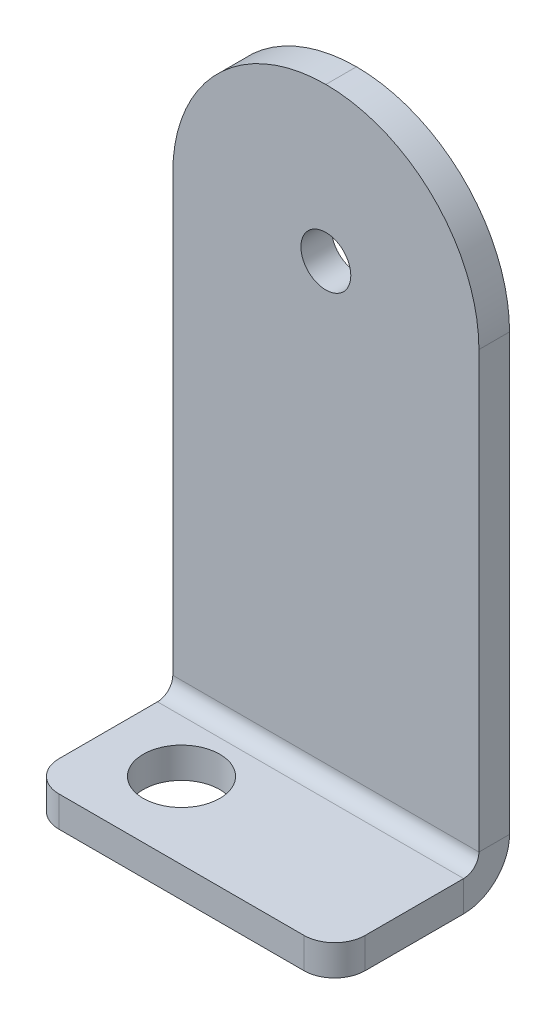
ISO-10303-21;
HEADER;
FILE_DESCRIPTION(('STEP AP214'),'2;1');
FILE_NAME('part.step','',(''),(''),'','','');
FILE_SCHEMA(('AUTOMOTIVE_DESIGN { 1 0 10303 214 1 1 1 1 }'));
ENDSEC;
DATA;
#1=APPLICATION_CONTEXT('core data for automotive mechanical design processes');
#2=APPLICATION_PROTOCOL_DEFINITION('international standard','automotive_design',2000,#1);
#3=PRODUCT_CONTEXT('',#1,'mechanical');
#4=PRODUCT('Part','Part','',(#3));
#5=PRODUCT_RELATED_PRODUCT_CATEGORY('part','',(#4));
#6=PRODUCT_DEFINITION_FORMATION('','',#4);
#7=PRODUCT_DEFINITION_CONTEXT('part definition',#1,'design');
#8=PRODUCT_DEFINITION('design','',#6,#7);
#9=PRODUCT_DEFINITION_SHAPE('','',#8);
#10=(LENGTH_UNIT() NAMED_UNIT(*) SI_UNIT(.MILLI.,.METRE.));
#11=(NAMED_UNIT(*) PLANE_ANGLE_UNIT() SI_UNIT($,.RADIAN.));
#12=(NAMED_UNIT(*) SI_UNIT($,.STERADIAN.) SOLID_ANGLE_UNIT());
#13=UNCERTAINTY_MEASURE_WITH_UNIT(LENGTH_MEASURE(1.E-05),#10,'distance_accuracy_value','');
#14=(GEOMETRIC_REPRESENTATION_CONTEXT(3) GLOBAL_UNCERTAINTY_ASSIGNED_CONTEXT((#13)) GLOBAL_UNIT_ASSIGNED_CONTEXT((#10,
#11,#12)) REPRESENTATION_CONTEXT('',''));
#15=CARTESIAN_POINT('',(0.,0.,0.));
#16=DIRECTION('',(0.,0.,1.));
#17=DIRECTION('',(1.,0.,0.));
#18=AXIS2_PLACEMENT_3D('',#15,#16,#17);
#19=CARTESIAN_POINT('',(0.,10.8849113350296,11.9750886649705));
#20=DIRECTION('',(0.,1.,0.));
#21=DIRECTION('',(1.,0.,0.));
#22=AXIS2_PLACEMENT_3D('',#19,#20,#21);
#23=PLANE('',#22);
#24=CARTESIAN_POINT('',(-19.05,10.8849113350295,5.6250886649705));
#25=DIRECTION('',(0.,1.,0.));
#26=DIRECTION('',(1.,0.,0.));
#27=AXIS2_PLACEMENT_3D('',#24,#25,#26);
#28=CIRCLE('',#27,3.175);
#29=CARTESIAN_POINT('',(-15.875,10.8849113350295,5.6250886649705));
#30=VERTEX_POINT('',#29);
#31=EDGE_CURVE('E180',#30,#30,#28,.T.);
#32=ORIENTED_EDGE('',*,*,#31,.T.);
#33=EDGE_LOOP('',(#32));
#34=FACE_BOUND('',#33,.T.);
#35=DIRECTION('',(0.,0.,-1.));
#36=VECTOR('',#35,1.);
#37=CARTESIAN_POINT('',(0.,10.8849113350296,11.9750886649705));
#38=LINE('',#37,#36);
#39=CARTESIAN_POINT('',(0.,10.8849113350296,9.4350886649705));
#40=VERTEX_POINT('',#39);
#41=CARTESIAN_POINT('',(0.,10.8849113350295,1.27000000000001));
#42=VERTEX_POINT('',#41);
#43=EDGE_CURVE('E195',#40,#42,#38,.T.);
#44=ORIENTED_EDGE('',*,*,#43,.F.);
#45=CARTESIAN_POINT('',(-2.54,10.8849113350296,9.4350886649705));
#46=DIRECTION('',(0.,1.,0.));
#47=DIRECTION('',(0.,0.,1.));
#48=AXIS2_PLACEMENT_3D('',#45,#46,#47);
#49=CIRCLE('',#48,2.54);
#50=CARTESIAN_POINT('',(-2.54,10.8849113350296,11.9750886649705));
#51=VERTEX_POINT('',#50);
#52=EDGE_CURVE('E53',#40,#51,#49,.F.);
#53=ORIENTED_EDGE('',*,*,#52,.T.);
#54=DIRECTION('',(1.,0.,0.));
#55=VECTOR('',#54,1.);
#56=CARTESIAN_POINT('',(0.,10.8849113350296,11.9750886649705));
#57=LINE('',#56,#55);
#58=CARTESIAN_POINT('',(-22.86,10.8849113350296,11.9750886649705));
#59=VERTEX_POINT('',#58);
#60=EDGE_CURVE('E188',#59,#51,#57,.T.);
#61=ORIENTED_EDGE('',*,*,#60,.F.);
#62=CARTESIAN_POINT('',(-22.86,10.8849113350296,9.4350886649705));
#63=DIRECTION('',(0.,1.,0.));
#64=DIRECTION('',(0.,0.,1.));
#65=AXIS2_PLACEMENT_3D('',#62,#63,#64);
#66=CIRCLE('',#65,2.54);
#67=CARTESIAN_POINT('',(-25.4,10.8849113350296,9.4350886649705));
#68=VERTEX_POINT('',#67);
#69=EDGE_CURVE('E60',#59,#68,#66,.F.);
#70=ORIENTED_EDGE('',*,*,#69,.T.);
#71=DIRECTION('',(0.,0.,1.));
#72=VECTOR('',#71,1.);
#73=CARTESIAN_POINT('',(-25.4,10.8849113350296,11.9750886649705));
#74=LINE('',#73,#72);
#75=CARTESIAN_POINT('',(-25.4,10.8849113350295,1.27000000000001));
#76=VERTEX_POINT('',#75);
#77=EDGE_CURVE('E191',#76,#68,#74,.T.);
#78=ORIENTED_EDGE('',*,*,#77,.F.);
#79=DIRECTION('',(1.,0.,0.));
#80=VECTOR('',#79,1.);
#81=CARTESIAN_POINT('',(0.,10.8849113350295,1.27000000000001));
#82=LINE('',#81,#80);
#83=EDGE_CURVE('E162',#76,#42,#82,.T.);
#84=ORIENTED_EDGE('',*,*,#83,.T.);
#85=EDGE_LOOP('',(#44,#53,#61,#70,#78,#84));
#86=FACE_BOUND('',#85,.T.);
#87=ADVANCED_FACE('F45',(#34,#86),#23,.F.);
#88=CARTESIAN_POINT('',(0.,10.8849113350296,11.9750886649705));
#89=DIRECTION('',(1.,0.,0.));
#90=DIRECTION('',(0.,-1.,0.));
#91=AXIS2_PLACEMENT_3D('',#88,#89,#90);
#92=PLANE('',#91);
#93=DIRECTION('',(0.,0.,-1.));
#94=VECTOR('',#93,1.);
#95=CARTESIAN_POINT('',(0.,13.4249113350296,11.9750886649705));
#96=LINE('',#95,#94);
#97=CARTESIAN_POINT('',(0.,13.4249113350296,9.43508866497049));
#98=VERTEX_POINT('',#97);
#99=CARTESIAN_POINT('',(0.,13.4249113350295,1.27000000000002));
#100=VERTEX_POINT('',#99);
#101=EDGE_CURVE('E184',#98,#100,#96,.T.);
#102=ORIENTED_EDGE('',*,*,#101,.F.);
#103=DIRECTION('',(0.,1.,0.));
#104=VECTOR('',#103,1.);
#105=CARTESIAN_POINT('',(0.,10.8849113350296,9.4350886649705));
#106=LINE('',#105,#104);
#107=EDGE_CURVE('E68',#98,#40,#106,.F.);
#108=ORIENTED_EDGE('',*,*,#107,.T.);
#109=ORIENTED_EDGE('',*,*,#43,.T.);
#110=DIRECTION('',(0.,-1.,0.));
#111=VECTOR('',#110,1.);
#112=CARTESIAN_POINT('',(0.,10.8849113350296,1.27000000000001));
#113=LINE('',#112,#111);
#114=EDGE_CURVE('E204',#100,#42,#113,.T.);
#115=ORIENTED_EDGE('',*,*,#114,.F.);
#116=EDGE_LOOP('',(#102,#108,#109,#115));
#117=FACE_BOUND('',#116,.T.);
#118=ADVANCED_FACE('F250',(#117),#92,.T.);
#119=CARTESIAN_POINT('',(0.,10.8849113350296,11.9750886649705));
#120=DIRECTION('',(0.,0.,1.));
#121=DIRECTION('',(1.,0.,0.));
#122=AXIS2_PLACEMENT_3D('',#119,#120,#121);
#123=PLANE('',#122);
#124=ORIENTED_EDGE('',*,*,#60,.T.);
#125=DIRECTION('',(0.,1.,0.));
#126=VECTOR('',#125,1.);
#127=CARTESIAN_POINT('',(-2.54,10.8849113350296,11.9750886649705));
#128=LINE('',#127,#126);
#129=CARTESIAN_POINT('',(-2.54,13.4249113350296,11.9750886649705));
#130=VERTEX_POINT('',#129);
#131=EDGE_CURVE('E229',#51,#130,#128,.T.);
#132=ORIENTED_EDGE('',*,*,#131,.T.);
#133=DIRECTION('',(1.,0.,0.));
#134=VECTOR('',#133,1.);
#135=CARTESIAN_POINT('',(0.,13.4249113350296,11.9750886649705));
#136=LINE('',#135,#134);
#137=CARTESIAN_POINT('',(-22.86,13.4249113350296,11.9750886649705));
#138=VERTEX_POINT('',#137);
#139=EDGE_CURVE('E192',#138,#130,#136,.T.);
#140=ORIENTED_EDGE('',*,*,#139,.F.);
#141=DIRECTION('',(0.,1.,0.));
#142=VECTOR('',#141,1.);
#143=CARTESIAN_POINT('',(-22.86,10.8849113350296,11.9750886649705));
#144=LINE('',#143,#142);
#145=EDGE_CURVE('E224',#138,#59,#144,.F.);
#146=ORIENTED_EDGE('',*,*,#145,.T.);
#147=EDGE_LOOP('',(#124,#132,#140,#146));
#148=FACE_BOUND('',#147,.T.);
#149=ADVANCED_FACE('F241',(#148),#123,.T.);
#150=CARTESIAN_POINT('',(-25.4,10.8849113350296,11.9750886649705));
#151=DIRECTION('',(-1.,0.,0.));
#152=DIRECTION('',(0.,1.,0.));
#153=AXIS2_PLACEMENT_3D('',#150,#151,#152);
#154=PLANE('',#153);
#155=ORIENTED_EDGE('',*,*,#77,.T.);
#156=DIRECTION('',(0.,1.,0.));
#157=VECTOR('',#156,1.);
#158=CARTESIAN_POINT('',(-25.4,10.8849113350296,9.4350886649705));
#159=LINE('',#158,#157);
#160=CARTESIAN_POINT('',(-25.4,13.4249113350296,9.4350886649705));
#161=VERTEX_POINT('',#160);
#162=EDGE_CURVE('E12',#68,#161,#159,.T.);
#163=ORIENTED_EDGE('',*,*,#162,.T.);
#164=DIRECTION('',(0.,0.,1.));
#165=VECTOR('',#164,1.);
#166=CARTESIAN_POINT('',(-25.4,13.4249113350296,11.9750886649705));
#167=LINE('',#166,#165);
#168=CARTESIAN_POINT('',(-25.4,13.4249113350295,1.27000000000002));
#169=VERTEX_POINT('',#168);
#170=EDGE_CURVE('E196',#169,#161,#167,.T.);
#171=ORIENTED_EDGE('',*,*,#170,.F.);
#172=DIRECTION('',(0.,1.,0.));
#173=VECTOR('',#172,1.);
#174=CARTESIAN_POINT('',(-25.4,10.8849113350296,1.27000000000001));
#175=LINE('',#174,#173);
#176=EDGE_CURVE('E198',#76,#169,#175,.T.);
#177=ORIENTED_EDGE('',*,*,#176,.F.);
#178=EDGE_LOOP('',(#155,#163,#171,#177));
#179=FACE_BOUND('',#178,.T.);
#180=ADVANCED_FACE('F262',(#179),#154,.T.);
#181=CARTESIAN_POINT('',(0.,13.4249113350296,11.9750886649705));
#182=DIRECTION('',(0.,1.,0.));
#183=DIRECTION('',(1.,0.,0.));
#184=AXIS2_PLACEMENT_3D('',#181,#182,#183);
#185=PLANE('',#184);
#186=ORIENTED_EDGE('',*,*,#139,.T.);
#187=CARTESIAN_POINT('',(-2.54,13.4249113350296,9.43508866497049));
#188=DIRECTION('',(0.,1.,0.));
#189=DIRECTION('',(0.,0.,1.));
#190=AXIS2_PLACEMENT_3D('',#187,#188,#189);
#191=CIRCLE('',#190,2.54);
#192=EDGE_CURVE('E234',#130,#98,#191,.T.);
#193=ORIENTED_EDGE('',*,*,#192,.T.);
#194=ORIENTED_EDGE('',*,*,#101,.T.);
#195=DIRECTION('',(1.,0.,0.));
#196=VECTOR('',#195,1.);
#197=CARTESIAN_POINT('',(0.,13.4249113350295,1.27000000000002));
#198=LINE('',#197,#196);
#199=EDGE_CURVE('E200',#169,#100,#198,.T.);
#200=ORIENTED_EDGE('',*,*,#199,.F.);
#201=ORIENTED_EDGE('',*,*,#170,.T.);
#202=CARTESIAN_POINT('',(-22.86,13.4249113350296,9.4350886649705));
#203=DIRECTION('',(0.,1.,0.));
#204=DIRECTION('',(0.,0.,1.));
#205=AXIS2_PLACEMENT_3D('',#202,#203,#204);
#206=CIRCLE('',#205,2.54);
#207=EDGE_CURVE('E232',#161,#138,#206,.T.);
#208=ORIENTED_EDGE('',*,*,#207,.T.);
#209=EDGE_LOOP('',(#186,#193,#194,#200,#201,#208));
#210=FACE_BOUND('',#209,.T.);
#211=CARTESIAN_POINT('',(-19.05,13.4249113350296,5.6250886649705));
#212=DIRECTION('',(0.,1.,0.));
#213=DIRECTION('',(1.,0.,0.));
#214=AXIS2_PLACEMENT_3D('',#211,#212,#213);
#215=CIRCLE('',#214,3.175);
#216=CARTESIAN_POINT('',(-15.875,13.4249113350296,5.6250886649705));
#217=VERTEX_POINT('',#216);
#218=EDGE_CURVE('E185',#217,#217,#215,.T.);
#219=ORIENTED_EDGE('',*,*,#218,.F.);
#220=EDGE_LOOP('',(#219));
#221=FACE_BOUND('',#220,.T.);
#222=ADVANCED_FACE('F246',(#210,#221),#185,.T.);
#223=CARTESIAN_POINT('',(-19.05,10.8849113350295,5.6250886649705));
#224=DIRECTION('',(0.,1.,0.));
#225=DIRECTION('',(1.,0.,0.));
#226=AXIS2_PLACEMENT_3D('',#223,#224,#225);
#227=CYLINDRICAL_SURFACE('',#226,3.175);
#228=ORIENTED_EDGE('',*,*,#31,.F.);
#229=EDGE_LOOP('',(#228));
#230=FACE_BOUND('',#229,.T.);
#231=ORIENTED_EDGE('',*,*,#218,.T.);
#232=EDGE_LOOP('',(#231));
#233=FACE_BOUND('',#232,.T.);
#234=ADVANCED_FACE('F283',(#230,#233),#227,.F.);
#235=CARTESIAN_POINT('',(-12.7,50.8,-2.54));
#236=DIRECTION('',(0.,0.,1.));
#237=DIRECTION('',(1.,0.,0.));
#238=AXIS2_PLACEMENT_3D('',#235,#236,#237);
#239=CYLINDRICAL_SURFACE('',#238,2.07009999999992);
#240=CARTESIAN_POINT('',(-12.7,50.8,-2.54));
#241=DIRECTION('',(0.,0.,1.));
#242=DIRECTION('',(1.,0.,0.));
#243=AXIS2_PLACEMENT_3D('',#240,#241,#242);
#244=CIRCLE('',#243,2.07009999999992);
#245=CARTESIAN_POINT('',(-10.6299000000001,50.8,-2.54));
#246=VERTEX_POINT('',#245);
#247=EDGE_CURVE('E140',#246,#246,#244,.T.);
#248=ORIENTED_EDGE('',*,*,#247,.F.);
#249=EDGE_LOOP('',(#248));
#250=FACE_BOUND('',#249,.T.);
#251=CARTESIAN_POINT('',(-12.7,50.8,0.));
#252=DIRECTION('',(0.,0.,1.));
#253=DIRECTION('',(1.,0.,0.));
#254=AXIS2_PLACEMENT_3D('',#251,#252,#253);
#255=CIRCLE('',#254,2.07009999999992);
#256=CARTESIAN_POINT('',(-10.6299000000001,50.8,0.));
#257=VERTEX_POINT('',#256);
#258=EDGE_CURVE('E172',#257,#257,#255,.T.);
#259=ORIENTED_EDGE('',*,*,#258,.T.);
#260=EDGE_LOOP('',(#259));
#261=FACE_BOUND('',#260,.T.);
#262=ADVANCED_FACE('F323',(#250,#261),#239,.F.);
#263=CARTESIAN_POINT('',(0.,0.,-2.54));
#264=DIRECTION('',(0.,0.,1.));
#265=DIRECTION('',(1.,0.,0.));
#266=AXIS2_PLACEMENT_3D('',#263,#264,#265);
#267=PLANE('',#266);
#268=DIRECTION('',(0.,-1.,0.));
#269=VECTOR('',#268,1.);
#270=CARTESIAN_POINT('',(-25.4,0.,-2.54));
#271=LINE('',#270,#269);
#272=CARTESIAN_POINT('',(-25.4,50.8,-2.54));
#273=VERTEX_POINT('',#272);
#274=CARTESIAN_POINT('',(-25.4,14.6949113350295,-2.54));
#275=VERTEX_POINT('',#274);
#276=EDGE_CURVE('E131',#273,#275,#271,.T.);
#277=ORIENTED_EDGE('',*,*,#276,.F.);
#278=CARTESIAN_POINT('',(-12.7,50.8,-2.54));
#279=DIRECTION('',(0.,0.,1.));
#280=DIRECTION('',(1.,0.,0.));
#281=AXIS2_PLACEMENT_3D('',#278,#279,#280);
#282=CIRCLE('',#281,12.7);
#283=CARTESIAN_POINT('',(-12.7,63.5,-2.54));
#284=VERTEX_POINT('',#283);
#285=EDGE_CURVE('E220',#273,#284,#282,.F.);
#286=ORIENTED_EDGE('',*,*,#285,.T.);
#287=CARTESIAN_POINT('',(-12.7,50.8,-2.54));
#288=DIRECTION('',(0.,0.,1.));
#289=DIRECTION('',(1.,0.,0.));
#290=AXIS2_PLACEMENT_3D('',#287,#288,#289);
#291=CIRCLE('',#290,12.7);
#292=CARTESIAN_POINT('',(0.,50.8,-2.54));
#293=VERTEX_POINT('',#292);
#294=EDGE_CURVE('E218',#284,#293,#291,.F.);
#295=ORIENTED_EDGE('',*,*,#294,.T.);
#296=DIRECTION('',(0.,1.,0.));
#297=VECTOR('',#296,1.);
#298=CARTESIAN_POINT('',(0.,0.,-2.54));
#299=LINE('',#298,#297);
#300=CARTESIAN_POINT('',(0.,14.6949113350295,-2.54));
#301=VERTEX_POINT('',#300);
#302=EDGE_CURVE('E170',#301,#293,#299,.T.);
#303=ORIENTED_EDGE('',*,*,#302,.F.);
#304=DIRECTION('',(1.,0.,0.));
#305=VECTOR('',#304,1.);
#306=CARTESIAN_POINT('',(0.,14.6949113350295,-2.54));
#307=LINE('',#306,#305);
#308=EDGE_CURVE('E159',#275,#301,#307,.T.);
#309=ORIENTED_EDGE('',*,*,#308,.F.);
#310=EDGE_LOOP('',(#277,#286,#295,#303,#309));
#311=FACE_BOUND('',#310,.T.);
#312=ORIENTED_EDGE('',*,*,#247,.T.);
#313=EDGE_LOOP('',(#312));
#314=FACE_BOUND('',#313,.T.);
#315=ADVANCED_FACE('F167',(#311,#314),#267,.F.);
#316=CARTESIAN_POINT('',(-25.4,0.,-2.54));
#317=DIRECTION('',(-1.,0.,0.));
#318=DIRECTION('',(0.,0.,1.));
#319=AXIS2_PLACEMENT_3D('',#316,#317,#318);
#320=PLANE('',#319);
#321=DIRECTION('',(0.,-1.,0.));
#322=VECTOR('',#321,1.);
#323=CARTESIAN_POINT('',(-25.4,0.,0.));
#324=LINE('',#323,#322);
#325=CARTESIAN_POINT('',(-25.4,50.8,0.));
#326=VERTEX_POINT('',#325);
#327=CARTESIAN_POINT('',(-25.4,14.6949113350295,0.));
#328=VERTEX_POINT('',#327);
#329=EDGE_CURVE('E154',#326,#328,#324,.T.);
#330=ORIENTED_EDGE('',*,*,#329,.F.);
#331=DIRECTION('',(0.,0.,1.));
#332=VECTOR('',#331,1.);
#333=CARTESIAN_POINT('',(-25.4,50.8,-2.54));
#334=LINE('',#333,#332);
#335=EDGE_CURVE('E137',#326,#273,#334,.F.);
#336=ORIENTED_EDGE('',*,*,#335,.T.);
#337=ORIENTED_EDGE('',*,*,#276,.T.);
#338=DIRECTION('',(0.,0.,1.));
#339=VECTOR('',#338,1.);
#340=CARTESIAN_POINT('',(-25.4,14.6949113350295,-2.5399999999999));
#341=LINE('',#340,#339);
#342=EDGE_CURVE('E135',#275,#328,#341,.T.);
#343=ORIENTED_EDGE('',*,*,#342,.T.);
#344=EDGE_LOOP('',(#330,#336,#337,#343));
#345=FACE_BOUND('',#344,.T.);
#346=ADVANCED_FACE('F134',(#345),#320,.T.);
#347=CARTESIAN_POINT('',(0.,0.,0.));
#348=DIRECTION('',(0.,0.,1.));
#349=DIRECTION('',(1.,0.,0.));
#350=AXIS2_PLACEMENT_3D('',#347,#348,#349);
#351=PLANE('',#350);
#352=ORIENTED_EDGE('',*,*,#258,.F.);
#353=EDGE_LOOP('',(#352));
#354=FACE_BOUND('',#353,.T.);
#355=CARTESIAN_POINT('',(-12.7,50.8,0.));
#356=DIRECTION('',(0.,0.,1.));
#357=DIRECTION('',(1.,0.,0.));
#358=AXIS2_PLACEMENT_3D('',#355,#356,#357);
#359=CIRCLE('',#358,12.7);
#360=CARTESIAN_POINT('',(0.,50.8,0.));
#361=VERTEX_POINT('',#360);
#362=CARTESIAN_POINT('',(-12.7,63.5,0.));
#363=VERTEX_POINT('',#362);
#364=EDGE_CURVE('E207',#361,#363,#359,.T.);
#365=ORIENTED_EDGE('',*,*,#364,.T.);
#366=CARTESIAN_POINT('',(-12.7,50.8,0.));
#367=DIRECTION('',(0.,0.,1.));
#368=DIRECTION('',(1.,0.,0.));
#369=AXIS2_PLACEMENT_3D('',#366,#367,#368);
#370=CIRCLE('',#369,12.7);
#371=EDGE_CURVE('E215',#363,#326,#370,.T.);
#372=ORIENTED_EDGE('',*,*,#371,.T.);
#373=ORIENTED_EDGE('',*,*,#329,.T.);
#374=DIRECTION('',(1.,0.,0.));
#375=VECTOR('',#374,1.);
#376=CARTESIAN_POINT('',(0.,14.6949113350295,0.));
#377=LINE('',#376,#375);
#378=CARTESIAN_POINT('',(0.,14.6949113350295,0.));
#379=VERTEX_POINT('',#378);
#380=EDGE_CURVE('E306',#328,#379,#377,.T.);
#381=ORIENTED_EDGE('',*,*,#380,.T.);
#382=DIRECTION('',(0.,1.,0.));
#383=VECTOR('',#382,1.);
#384=CARTESIAN_POINT('',(0.,0.,0.));
#385=LINE('',#384,#383);
#386=EDGE_CURVE('E302',#379,#361,#385,.T.);
#387=ORIENTED_EDGE('',*,*,#386,.T.);
#388=EDGE_LOOP('',(#365,#372,#373,#381,#387));
#389=FACE_BOUND('',#388,.T.);
#390=ADVANCED_FACE('F305',(#354,#389),#351,.T.);
#391=CARTESIAN_POINT('',(0.,0.,-2.54));
#392=DIRECTION('',(1.,0.,0.));
#393=DIRECTION('',(0.,0.,-1.));
#394=AXIS2_PLACEMENT_3D('',#391,#392,#393);
#395=PLANE('',#394);
#396=ORIENTED_EDGE('',*,*,#302,.T.);
#397=DIRECTION('',(0.,0.,1.));
#398=VECTOR('',#397,1.);
#399=CARTESIAN_POINT('',(0.,50.8,-2.54));
#400=LINE('',#399,#398);
#401=EDGE_CURVE('E222',#293,#361,#400,.T.);
#402=ORIENTED_EDGE('',*,*,#401,.T.);
#403=ORIENTED_EDGE('',*,*,#386,.F.);
#404=DIRECTION('',(0.,0.,-1.));
#405=VECTOR('',#404,1.);
#406=CARTESIAN_POINT('',(0.,14.6949113350295,-2.5399999999999));
#407=LINE('',#406,#405);
#408=EDGE_CURVE('E255',#379,#301,#407,.T.);
#409=ORIENTED_EDGE('',*,*,#408,.T.);
#410=EDGE_LOOP('',(#396,#402,#403,#409));
#411=FACE_BOUND('',#410,.T.);
#412=ADVANCED_FACE('F301',(#411),#395,.T.);
#413=CARTESIAN_POINT('',(-25.4,14.6949113350295,1.27));
#414=DIRECTION('',(-1.,0.,0.));
#415=DIRECTION('',(0.,0.,1.));
#416=AXIS2_PLACEMENT_3D('',#413,#414,#415);
#417=PLANE('',#416);
#418=ORIENTED_EDGE('',*,*,#176,.T.);
#419=CARTESIAN_POINT('',(-25.4,14.6949113350295,1.27));
#420=DIRECTION('',(-1.,0.,0.));
#421=DIRECTION('',(0.,0.,1.));
#422=AXIS2_PLACEMENT_3D('',#419,#420,#421);
#423=CIRCLE('',#422,1.27);
#424=EDGE_CURVE('E151',#169,#328,#423,.F.);
#425=ORIENTED_EDGE('',*,*,#424,.T.);
#426=ORIENTED_EDGE('',*,*,#342,.F.);
#427=CARTESIAN_POINT('',(-25.4,14.6949113350295,1.27));
#428=DIRECTION('',(1.,0.,0.));
#429=DIRECTION('',(0.,0.,1.));
#430=AXIS2_PLACEMENT_3D('',#427,#428,#429);
#431=CIRCLE('',#430,3.81);
#432=EDGE_CURVE('E148',#76,#275,#431,.T.);
#433=ORIENTED_EDGE('',*,*,#432,.F.);
#434=EDGE_LOOP('',(#418,#425,#426,#433));
#435=FACE_BOUND('',#434,.T.);
#436=ADVANCED_FACE('F147',(#435),#417,.T.);
#437=CARTESIAN_POINT('',(0.,14.6949113350295,1.27));
#438=DIRECTION('',(1.,0.,0.));
#439=DIRECTION('',(0.,0.,-1.));
#440=AXIS2_PLACEMENT_3D('',#437,#438,#439);
#441=PLANE('',#440);
#442=ORIENTED_EDGE('',*,*,#408,.F.);
#443=CARTESIAN_POINT('',(0.,14.6949113350295,1.27));
#444=DIRECTION('',(-1.,0.,0.));
#445=DIRECTION('',(0.,0.,1.));
#446=AXIS2_PLACEMENT_3D('',#443,#444,#445);
#447=CIRCLE('',#446,1.27);
#448=EDGE_CURVE('E164',#379,#100,#447,.T.);
#449=ORIENTED_EDGE('',*,*,#448,.T.);
#450=ORIENTED_EDGE('',*,*,#114,.T.);
#451=CARTESIAN_POINT('',(0.,14.6949113350295,1.27));
#452=DIRECTION('',(-1.,0.,0.));
#453=DIRECTION('',(0.,0.,-1.));
#454=AXIS2_PLACEMENT_3D('',#451,#452,#453);
#455=CIRCLE('',#454,3.81);
#456=EDGE_CURVE('E163',#301,#42,#455,.T.);
#457=ORIENTED_EDGE('',*,*,#456,.F.);
#458=EDGE_LOOP('',(#442,#449,#450,#457));
#459=FACE_BOUND('',#458,.T.);
#460=ADVANCED_FACE('F254',(#459),#441,.T.);
#461=CARTESIAN_POINT('',(13.1366074579949,14.6949113350295,1.27));
#462=DIRECTION('',(-1.,0.,0.));
#463=DIRECTION('',(0.,0.,1.));
#464=AXIS2_PLACEMENT_3D('',#461,#462,#463);
#465=CYLINDRICAL_SURFACE('',#464,3.81);
#466=ORIENTED_EDGE('',*,*,#456,.T.);
#467=ORIENTED_EDGE('',*,*,#83,.F.);
#468=ORIENTED_EDGE('',*,*,#432,.T.);
#469=ORIENTED_EDGE('',*,*,#308,.T.);
#470=EDGE_LOOP('',(#466,#467,#468,#469));
#471=FACE_BOUND('',#470,.T.);
#472=ADVANCED_FACE('F158',(#471),#465,.T.);
#473=CARTESIAN_POINT('',(13.1366074579949,14.6949113350295,1.27));
#474=DIRECTION('',(-1.,0.,0.));
#475=DIRECTION('',(0.,0.,1.));
#476=AXIS2_PLACEMENT_3D('',#473,#474,#475);
#477=CYLINDRICAL_SURFACE('',#476,1.27);
#478=ORIENTED_EDGE('',*,*,#448,.F.);
#479=ORIENTED_EDGE('',*,*,#380,.F.);
#480=ORIENTED_EDGE('',*,*,#424,.F.);
#481=ORIENTED_EDGE('',*,*,#199,.T.);
#482=EDGE_LOOP('',(#478,#479,#480,#481));
#483=FACE_BOUND('',#482,.T.);
#484=ADVANCED_FACE('F259',(#483),#477,.F.);
#485=CARTESIAN_POINT('',(-12.7,50.8,-2.54));
#486=DIRECTION('',(0.,0.,1.));
#487=DIRECTION('',(1.,0.,0.));
#488=AXIS2_PLACEMENT_3D('',#485,#486,#487);
#489=CYLINDRICAL_SURFACE('',#488,12.7);
#490=ORIENTED_EDGE('',*,*,#401,.F.);
#491=ORIENTED_EDGE('',*,*,#294,.F.);
#492=DIRECTION('',(0.,0.,1.));
#493=VECTOR('',#492,1.);
#494=CARTESIAN_POINT('',(-12.7,63.5,-2.54));
#495=LINE('',#494,#493);
#496=EDGE_CURVE('E225',#363,#284,#495,.F.);
#497=ORIENTED_EDGE('',*,*,#496,.F.);
#498=ORIENTED_EDGE('',*,*,#364,.F.);
#499=EDGE_LOOP('',(#490,#491,#497,#498));
#500=FACE_BOUND('',#499,.T.);
#501=ADVANCED_FACE('F287',(#500),#489,.T.);
#502=CARTESIAN_POINT('',(-12.7,50.8,-2.54));
#503=DIRECTION('',(0.,0.,1.));
#504=DIRECTION('',(1.,0.,0.));
#505=AXIS2_PLACEMENT_3D('',#502,#503,#504);
#506=CYLINDRICAL_SURFACE('',#505,12.7);
#507=ORIENTED_EDGE('',*,*,#285,.F.);
#508=ORIENTED_EDGE('',*,*,#335,.F.);
#509=ORIENTED_EDGE('',*,*,#371,.F.);
#510=ORIENTED_EDGE('',*,*,#496,.T.);
#511=EDGE_LOOP('',(#507,#508,#509,#510));
#512=FACE_BOUND('',#511,.T.);
#513=ADVANCED_FACE('F269',(#512),#506,.T.);
#514=CARTESIAN_POINT('',(-2.54,10.8849113350296,9.4350886649705));
#515=DIRECTION('',(0.,1.,0.));
#516=DIRECTION('',(0.,0.,1.));
#517=AXIS2_PLACEMENT_3D('',#514,#515,#516);
#518=CYLINDRICAL_SURFACE('',#517,2.54);
#519=ORIENTED_EDGE('',*,*,#52,.F.);
#520=ORIENTED_EDGE('',*,*,#107,.F.);
#521=ORIENTED_EDGE('',*,*,#192,.F.);
#522=ORIENTED_EDGE('',*,*,#131,.F.);
#523=EDGE_LOOP('',(#519,#520,#521,#522));
#524=FACE_BOUND('',#523,.T.);
#525=ADVANCED_FACE('F244',(#524),#518,.T.);
#526=CARTESIAN_POINT('',(-22.86,10.8849113350296,9.4350886649705));
#527=DIRECTION('',(0.,1.,0.));
#528=DIRECTION('',(0.,0.,1.));
#529=AXIS2_PLACEMENT_3D('',#526,#527,#528);
#530=CYLINDRICAL_SURFACE('',#529,2.54);
#531=ORIENTED_EDGE('',*,*,#69,.F.);
#532=ORIENTED_EDGE('',*,*,#145,.F.);
#533=ORIENTED_EDGE('',*,*,#207,.F.);
#534=ORIENTED_EDGE('',*,*,#162,.F.);
#535=EDGE_LOOP('',(#531,#532,#533,#534));
#536=FACE_BOUND('',#535,.T.);
#537=ADVANCED_FACE('F47',(#536),#530,.T.);
#538=CLOSED_SHELL('',(#87,#118,#149,#180,#222,#234,#262,#315,#346,#390,#412,#436,#460,#472,#484,
#501,#513,#525,#537));
#539=MANIFOLD_SOLID_BREP('B2',#538);
#540=ADVANCED_BREP_SHAPE_REPRESENTATION('',(#18,#539),#14);
#541=SHAPE_DEFINITION_REPRESENTATION(#9,#540);
ENDSEC;
END-ISO-10303-21;
